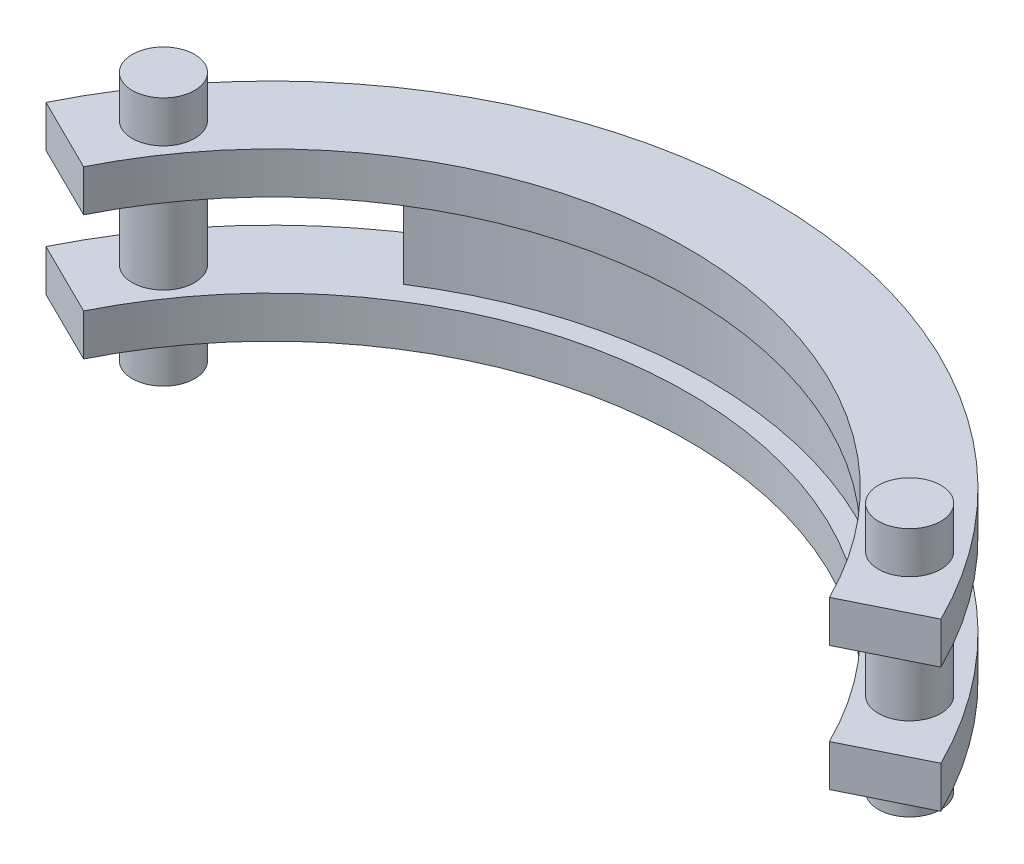
ISO-10303-21;
HEADER;
FILE_DESCRIPTION(('STEP AP214'),'2;1');
FILE_NAME('part.step','',(''),(''),'','','');
FILE_SCHEMA(('AUTOMOTIVE_DESIGN { 1 0 10303 214 1 1 1 1 }'));
ENDSEC;
DATA;
#1=APPLICATION_CONTEXT('core data for automotive mechanical design processes');
#2=APPLICATION_PROTOCOL_DEFINITION('international standard','automotive_design',2000,#1);
#3=PRODUCT_CONTEXT('',#1,'mechanical');
#4=PRODUCT('Part','Part','',(#3));
#5=PRODUCT_RELATED_PRODUCT_CATEGORY('part','',(#4));
#6=PRODUCT_DEFINITION_FORMATION('','',#4);
#7=PRODUCT_DEFINITION_CONTEXT('part definition',#1,'design');
#8=PRODUCT_DEFINITION('design','',#6,#7);
#9=PRODUCT_DEFINITION_SHAPE('','',#8);
#10=(LENGTH_UNIT() NAMED_UNIT(*) SI_UNIT(.MILLI.,.METRE.));
#11=(NAMED_UNIT(*) PLANE_ANGLE_UNIT() SI_UNIT($,.RADIAN.));
#12=(NAMED_UNIT(*) SI_UNIT($,.STERADIAN.) SOLID_ANGLE_UNIT());
#13=UNCERTAINTY_MEASURE_WITH_UNIT(LENGTH_MEASURE(1.E-05),#10,'distance_accuracy_value','');
#14=(GEOMETRIC_REPRESENTATION_CONTEXT(3) GLOBAL_UNCERTAINTY_ASSIGNED_CONTEXT((#13)) GLOBAL_UNIT_ASSIGNED_CONTEXT((#10,
#11,#12)) REPRESENTATION_CONTEXT('',''));
#15=CARTESIAN_POINT('',(0.,0.,0.));
#16=DIRECTION('',(0.,0.,1.));
#17=DIRECTION('',(1.,0.,0.));
#18=AXIS2_PLACEMENT_3D('',#15,#16,#17);
#19=CARTESIAN_POINT('',(0.,10.,0.));
#20=DIRECTION('',(0.,-1.,0.));
#21=DIRECTION('',(0.,0.,-1.));
#22=AXIS2_PLACEMENT_3D('',#19,#20,#21);
#23=PLANE('',#22);
#24=CARTESIAN_POINT('',(89.6581173448026,10.,-63.6162090952759));
#25=DIRECTION('',(0.,1.,0.));
#26=DIRECTION('',(0.,0.,-1.));
#27=AXIS2_PLACEMENT_3D('',#24,#25,#26);
#28=CIRCLE('',#27,7.50000000000001);
#29=CARTESIAN_POINT('',(89.6581173448026,10.,-71.1162090952759));
#30=VERTEX_POINT('',#29);
#31=EDGE_CURVE('E150',#30,#30,#28,.T.);
#32=ORIENTED_EDGE('',*,*,#31,.F.);
#33=EDGE_LOOP('',(#32));
#34=FACE_BOUND('',#33,.T.);
#35=CARTESIAN_POINT('',(-89.6581173448026,10.,-63.6162090952759));
#36=DIRECTION('',(0.,-1.,0.));
#37=DIRECTION('',(0.,0.,-1.));
#38=AXIS2_PLACEMENT_3D('',#35,#36,#37);
#39=CIRCLE('',#38,7.50000000000001);
#40=CARTESIAN_POINT('',(-89.6581173448026,10.,-71.1162090952759));
#41=VERTEX_POINT('',#40);
#42=EDGE_CURVE('E175',#41,#41,#39,.T.);
#43=ORIENTED_EDGE('',*,*,#42,.T.);
#44=EDGE_LOOP('',(#43));
#45=FACE_BOUND('',#44,.T.);
#46=CARTESIAN_POINT('',(0.,10.,0.));
#47=DIRECTION('',(0.,1.,0.));
#48=DIRECTION('',(0.,0.,-1.));
#49=AXIS2_PLACEMENT_3D('',#46,#47,#48);
#50=CIRCLE('',#49,120.);
#51=CARTESIAN_POINT('',(107.52965302655,10.,-53.2670040455598));
#52=VERTEX_POINT('',#51);
#53=CARTESIAN_POINT('',(-107.52965302655,10.,-53.2670040455598));
#54=VERTEX_POINT('',#53);
#55=EDGE_CURVE('E228',#52,#54,#50,.T.);
#56=ORIENTED_EDGE('',*,*,#55,.T.);
#57=DIRECTION('',(0.89608044188792,0.,0.443891700379664));
#58=VECTOR('',#57,1.);
#59=CARTESIAN_POINT('',(-107.52965302655,10.,-53.2670040455598));
#60=LINE('',#59,#58);
#61=CARTESIAN_POINT('',(-89.608044188792,10.,-44.3891700379665));
#62=VERTEX_POINT('',#61);
#63=EDGE_CURVE('E231',#54,#62,#60,.T.);
#64=ORIENTED_EDGE('',*,*,#63,.T.);
#65=CARTESIAN_POINT('',(0.,10.,0.));
#66=DIRECTION('',(0.,-1.,0.));
#67=DIRECTION('',(0.,0.,-1.));
#68=AXIS2_PLACEMENT_3D('',#65,#66,#67);
#69=CIRCLE('',#68,100.);
#70=CARTESIAN_POINT('',(89.608044188792,10.,-44.3891700379665));
#71=VERTEX_POINT('',#70);
#72=EDGE_CURVE('E226',#62,#71,#69,.T.);
#73=ORIENTED_EDGE('',*,*,#72,.T.);
#74=DIRECTION('',(-0.89608044188792,0.,0.443891700379664));
#75=VECTOR('',#74,1.);
#76=CARTESIAN_POINT('',(107.52965302655,10.,-53.2670040455598));
#77=LINE('',#76,#75);
#78=EDGE_CURVE('E155',#52,#71,#77,.T.);
#79=ORIENTED_EDGE('',*,*,#78,.F.);
#80=EDGE_LOOP('',(#56,#64,#73,#79));
#81=FACE_BOUND('',#80,.T.);
#82=CARTESIAN_POINT('',(0.,10.,0.));
#83=DIRECTION('',(0.,1.,0.));
#84=DIRECTION('',(0.,0.,1.));
#85=AXIS2_PLACEMENT_3D('',#82,#83,#84);
#86=CIRCLE('',#85,115.);
#87=CARTESIAN_POINT('',(62.0972802906275,10.,-96.7932217694361));
#88=VERTEX_POINT('',#87);
#89=CARTESIAN_POINT('',(-62.0972802906275,10.,-96.7932217694361));
#90=VERTEX_POINT('',#89);
#91=EDGE_CURVE('E48',#88,#90,#86,.T.);
#92=ORIENTED_EDGE('',*,*,#91,.F.);
#93=DIRECTION('',(0.539976350353283,0.,-0.841680189299445));
#94=VECTOR('',#93,1.);
#95=CARTESIAN_POINT('',(62.0972802906275,10.,-96.7932217694361));
#96=LINE('',#95,#94);
#97=CARTESIAN_POINT('',(56.6975167870947,10.,-88.3764198764417));
#98=VERTEX_POINT('',#97);
#99=EDGE_CURVE('E52',#98,#88,#96,.T.);
#100=ORIENTED_EDGE('',*,*,#99,.F.);
#101=CARTESIAN_POINT('',(0.,10.,0.));
#102=DIRECTION('',(0.,-1.,0.));
#103=DIRECTION('',(0.,0.,1.));
#104=AXIS2_PLACEMENT_3D('',#101,#102,#103);
#105=CIRCLE('',#104,105.);
#106=CARTESIAN_POINT('',(-56.6975167870947,10.,-88.3764198764417));
#107=VERTEX_POINT('',#106);
#108=EDGE_CURVE('E210',#107,#98,#105,.T.);
#109=ORIENTED_EDGE('',*,*,#108,.F.);
#110=DIRECTION('',(0.539976350353283,0.,0.841680189299445));
#111=VECTOR('',#110,1.);
#112=CARTESIAN_POINT('',(-62.0972802906275,10.,-96.7932217694361));
#113=LINE('',#112,#111);
#114=EDGE_CURVE('E207',#90,#107,#113,.T.);
#115=ORIENTED_EDGE('',*,*,#114,.F.);
#116=EDGE_LOOP('',(#92,#100,#109,#115));
#117=FACE_BOUND('',#116,.T.);
#118=ADVANCED_FACE('F33',(#34,#45,#81,#117),#23,.F.);
#119=CARTESIAN_POINT('',(0.,10.,0.));
#120=DIRECTION('',(0.,-1.,0.));
#121=DIRECTION('',(0.,0.,-1.));
#122=AXIS2_PLACEMENT_3D('',#119,#120,#121);
#123=CYLINDRICAL_SURFACE('',#122,100.);
#124=DIRECTION('',(0.,-1.,0.));
#125=VECTOR('',#124,1.);
#126=CARTESIAN_POINT('',(89.608044188792,10.,-44.3891700379665));
#127=LINE('',#126,#125);
#128=CARTESIAN_POINT('',(89.608044188792,0.,-44.3891700379665));
#129=VERTEX_POINT('',#128);
#130=EDGE_CURVE('E158',#71,#129,#127,.T.);
#131=ORIENTED_EDGE('',*,*,#130,.F.);
#132=ORIENTED_EDGE('',*,*,#72,.F.);
#133=DIRECTION('',(0.,-1.,0.));
#134=VECTOR('',#133,1.);
#135=CARTESIAN_POINT('',(-89.608044188792,10.,-44.3891700379665));
#136=LINE('',#135,#134);
#137=CARTESIAN_POINT('',(-89.608044188792,0.,-44.3891700379665));
#138=VERTEX_POINT('',#137);
#139=EDGE_CURVE('E233',#62,#138,#136,.T.);
#140=ORIENTED_EDGE('',*,*,#139,.T.);
#141=CARTESIAN_POINT('',(0.,0.,0.));
#142=DIRECTION('',(0.,-1.,0.));
#143=DIRECTION('',(0.,0.,-1.));
#144=AXIS2_PLACEMENT_3D('',#141,#142,#143);
#145=CIRCLE('',#144,100.);
#146=EDGE_CURVE('E225',#138,#129,#145,.T.);
#147=ORIENTED_EDGE('',*,*,#146,.T.);
#148=EDGE_LOOP('',(#131,#132,#140,#147));
#149=FACE_BOUND('',#148,.T.);
#150=ADVANCED_FACE('F35',(#149),#123,.F.);
#151=CARTESIAN_POINT('',(0.,10.,0.));
#152=DIRECTION('',(0.,-1.,0.));
#153=DIRECTION('',(0.,0.,-1.));
#154=AXIS2_PLACEMENT_3D('',#151,#152,#153);
#155=CYLINDRICAL_SURFACE('',#154,120.);
#156=CARTESIAN_POINT('',(0.,0.,0.));
#157=DIRECTION('',(0.,1.,0.));
#158=DIRECTION('',(0.,0.,-1.));
#159=AXIS2_PLACEMENT_3D('',#156,#157,#158);
#160=CIRCLE('',#159,120.);
#161=CARTESIAN_POINT('',(107.52965302655,0.,-53.2670040455598));
#162=VERTEX_POINT('',#161);
#163=CARTESIAN_POINT('',(-107.52965302655,0.,-53.2670040455598));
#164=VERTEX_POINT('',#163);
#165=EDGE_CURVE('E235',#162,#164,#160,.T.);
#166=ORIENTED_EDGE('',*,*,#165,.T.);
#167=DIRECTION('',(0.,-1.,0.));
#168=VECTOR('',#167,1.);
#169=CARTESIAN_POINT('',(-107.52965302655,10.,-53.2670040455598));
#170=LINE('',#169,#168);
#171=EDGE_CURVE('E240',#54,#164,#170,.T.);
#172=ORIENTED_EDGE('',*,*,#171,.F.);
#173=ORIENTED_EDGE('',*,*,#55,.F.);
#174=DIRECTION('',(0.,-1.,0.));
#175=VECTOR('',#174,1.);
#176=CARTESIAN_POINT('',(107.52965302655,10.,-53.2670040455598));
#177=LINE('',#176,#175);
#178=EDGE_CURVE('E163',#52,#162,#177,.T.);
#179=ORIENTED_EDGE('',*,*,#178,.T.);
#180=EDGE_LOOP('',(#166,#172,#173,#179));
#181=FACE_BOUND('',#180,.T.);
#182=ADVANCED_FACE('F278',(#181),#155,.T.);
#183=CARTESIAN_POINT('',(-107.52965302655,10.,-53.2670040455598));
#184=DIRECTION('',(0.443891700379664,0.,-0.89608044188792));
#185=DIRECTION('',(-0.89608044188792,0.,-0.443891700379664));
#186=AXIS2_PLACEMENT_3D('',#183,#184,#185);
#187=PLANE('',#186);
#188=DIRECTION('',(0.89608044188792,0.,0.443891700379664));
#189=VECTOR('',#188,1.);
#190=CARTESIAN_POINT('',(-107.52965302655,0.,-53.2670040455598));
#191=LINE('',#190,#189);
#192=EDGE_CURVE('E229',#164,#138,#191,.T.);
#193=ORIENTED_EDGE('',*,*,#192,.T.);
#194=ORIENTED_EDGE('',*,*,#139,.F.);
#195=ORIENTED_EDGE('',*,*,#63,.F.);
#196=ORIENTED_EDGE('',*,*,#171,.T.);
#197=EDGE_LOOP('',(#193,#194,#195,#196));
#198=FACE_BOUND('',#197,.T.);
#199=ADVANCED_FACE('F289',(#198),#187,.F.);
#200=CARTESIAN_POINT('',(0.,0.,0.));
#201=DIRECTION('',(0.,-1.,0.));
#202=DIRECTION('',(0.,0.,-1.));
#203=AXIS2_PLACEMENT_3D('',#200,#201,#202);
#204=PLANE('',#203);
#205=DIRECTION('',(-0.89608044188792,0.,0.443891700379664));
#206=VECTOR('',#205,1.);
#207=CARTESIAN_POINT('',(107.52965302655,0.,-53.2670040455598));
#208=LINE('',#207,#206);
#209=EDGE_CURVE('E141',#162,#129,#208,.T.);
#210=ORIENTED_EDGE('',*,*,#209,.T.);
#211=ORIENTED_EDGE('',*,*,#146,.F.);
#212=ORIENTED_EDGE('',*,*,#192,.F.);
#213=ORIENTED_EDGE('',*,*,#165,.F.);
#214=EDGE_LOOP('',(#210,#211,#212,#213));
#215=FACE_BOUND('',#214,.T.);
#216=CARTESIAN_POINT('',(89.6581173448026,0.,-63.6162090952759));
#217=DIRECTION('',(0.,-1.,0.));
#218=DIRECTION('',(0.,0.,-1.));
#219=AXIS2_PLACEMENT_3D('',#216,#217,#218);
#220=CIRCLE('',#219,7.50000000000001);
#221=CARTESIAN_POINT('',(89.6581173448026,0.,-71.1162090952759));
#222=VERTEX_POINT('',#221);
#223=EDGE_CURVE('E11',#222,#222,#220,.T.);
#224=ORIENTED_EDGE('',*,*,#223,.F.);
#225=EDGE_LOOP('',(#224));
#226=FACE_BOUND('',#225,.T.);
#227=CARTESIAN_POINT('',(-89.6581173448026,0.,-63.6162090952759));
#228=DIRECTION('',(0.,-1.,0.));
#229=DIRECTION('',(0.,0.,-1.));
#230=AXIS2_PLACEMENT_3D('',#227,#228,#229);
#231=CIRCLE('',#230,7.50000000000001);
#232=CARTESIAN_POINT('',(-89.6581173448026,0.,-71.1162090952759));
#233=VERTEX_POINT('',#232);
#234=EDGE_CURVE('E176',#233,#233,#231,.T.);
#235=ORIENTED_EDGE('',*,*,#234,.F.);
#236=EDGE_LOOP('',(#235));
#237=FACE_BOUND('',#236,.T.);
#238=ADVANCED_FACE('F286',(#215,#226,#237),#204,.T.);
#239=CARTESIAN_POINT('',(0.,20.,0.));
#240=DIRECTION('',(0.,-1.,0.));
#241=DIRECTION('',(0.,0.,-1.));
#242=AXIS2_PLACEMENT_3D('',#239,#240,#241);
#243=CYLINDRICAL_SURFACE('',#242,115.);
#244=ORIENTED_EDGE('',*,*,#91,.T.);
#245=DIRECTION('',(0.,-1.,0.));
#246=VECTOR('',#245,1.);
#247=CARTESIAN_POINT('',(-62.0972802906275,20.,-96.7932217694361));
#248=LINE('',#247,#246);
#249=CARTESIAN_POINT('',(-62.0972802906275,30.,-96.7932217694361));
#250=VERTEX_POINT('',#249);
#251=EDGE_CURVE('E222',#250,#90,#248,.T.);
#252=ORIENTED_EDGE('',*,*,#251,.F.);
#253=CARTESIAN_POINT('',(0.,30.,0.));
#254=DIRECTION('',(0.,1.,0.));
#255=DIRECTION('',(0.,0.,1.));
#256=AXIS2_PLACEMENT_3D('',#253,#254,#255);
#257=CIRCLE('',#256,115.);
#258=CARTESIAN_POINT('',(62.0972802906275,30.,-96.7932217694361));
#259=VERTEX_POINT('',#258);
#260=EDGE_CURVE('E182',#259,#250,#257,.T.);
#261=ORIENTED_EDGE('',*,*,#260,.F.);
#262=DIRECTION('',(0.,-1.,0.));
#263=VECTOR('',#262,1.);
#264=CARTESIAN_POINT('',(62.0972802906275,20.,-96.7932217694361));
#265=LINE('',#264,#263);
#266=EDGE_CURVE('E213',#259,#88,#265,.T.);
#267=ORIENTED_EDGE('',*,*,#266,.T.);
#268=EDGE_LOOP('',(#244,#252,#261,#267));
#269=FACE_BOUND('',#268,.T.);
#270=ADVANCED_FACE('F284',(#269),#243,.T.);
#271=CARTESIAN_POINT('',(-62.0972802906275,20.,-96.7932217694361));
#272=DIRECTION('',(0.841680189299445,0.,-0.539976350353282));
#273=DIRECTION('',(-0.539976350353282,0.,-0.841680189299445));
#274=AXIS2_PLACEMENT_3D('',#271,#272,#273);
#275=PLANE('',#274);
#276=ORIENTED_EDGE('',*,*,#114,.T.);
#277=DIRECTION('',(0.,-1.,0.));
#278=VECTOR('',#277,1.);
#279=CARTESIAN_POINT('',(-56.6975167870947,20.,-88.3764198764417));
#280=LINE('',#279,#278);
#281=CARTESIAN_POINT('',(-56.6975167870947,30.,-88.3764198764417));
#282=VERTEX_POINT('',#281);
#283=EDGE_CURVE('E219',#282,#107,#280,.T.);
#284=ORIENTED_EDGE('',*,*,#283,.F.);
#285=DIRECTION('',(0.539976350353283,0.,0.841680189299445));
#286=VECTOR('',#285,1.);
#287=CARTESIAN_POINT('',(-62.0972802906275,30.,-96.7932217694361));
#288=LINE('',#287,#286);
#289=EDGE_CURVE('E185',#250,#282,#288,.T.);
#290=ORIENTED_EDGE('',*,*,#289,.F.);
#291=ORIENTED_EDGE('',*,*,#251,.T.);
#292=EDGE_LOOP('',(#276,#284,#290,#291));
#293=FACE_BOUND('',#292,.T.);
#294=ADVANCED_FACE('F358',(#293),#275,.F.);
#295=CARTESIAN_POINT('',(0.,20.,0.));
#296=DIRECTION('',(0.,-1.,0.));
#297=DIRECTION('',(0.,0.,-1.));
#298=AXIS2_PLACEMENT_3D('',#295,#296,#297);
#299=CYLINDRICAL_SURFACE('',#298,105.);
#300=ORIENTED_EDGE('',*,*,#108,.T.);
#301=DIRECTION('',(0.,-1.,0.));
#302=VECTOR('',#301,1.);
#303=CARTESIAN_POINT('',(56.6975167870947,20.,-88.3764198764417));
#304=LINE('',#303,#302);
#305=CARTESIAN_POINT('',(56.6975167870947,30.,-88.3764198764417));
#306=VERTEX_POINT('',#305);
#307=EDGE_CURVE('E216',#306,#98,#304,.T.);
#308=ORIENTED_EDGE('',*,*,#307,.F.);
#309=CARTESIAN_POINT('',(0.,30.,0.));
#310=DIRECTION('',(0.,-1.,0.));
#311=DIRECTION('',(0.,0.,1.));
#312=AXIS2_PLACEMENT_3D('',#309,#310,#311);
#313=CIRCLE('',#312,105.);
#314=EDGE_CURVE('E188',#282,#306,#313,.T.);
#315=ORIENTED_EDGE('',*,*,#314,.F.);
#316=ORIENTED_EDGE('',*,*,#283,.T.);
#317=EDGE_LOOP('',(#300,#308,#315,#316));
#318=FACE_BOUND('',#317,.T.);
#319=ADVANCED_FACE('F355',(#318),#299,.F.);
#320=CARTESIAN_POINT('',(62.0972802906275,20.,-96.7932217694361));
#321=DIRECTION('',(-0.841680189299445,0.,-0.539976350353282));
#322=DIRECTION('',(-0.539976350353282,0.,0.841680189299445));
#323=AXIS2_PLACEMENT_3D('',#320,#321,#322);
#324=PLANE('',#323);
#325=ORIENTED_EDGE('',*,*,#99,.T.);
#326=ORIENTED_EDGE('',*,*,#266,.F.);
#327=DIRECTION('',(0.539976350353283,0.,-0.841680189299445));
#328=VECTOR('',#327,1.);
#329=CARTESIAN_POINT('',(62.0972802906275,30.,-96.7932217694361));
#330=LINE('',#329,#328);
#331=EDGE_CURVE('E191',#306,#259,#330,.T.);
#332=ORIENTED_EDGE('',*,*,#331,.F.);
#333=ORIENTED_EDGE('',*,*,#307,.T.);
#334=EDGE_LOOP('',(#325,#326,#332,#333));
#335=FACE_BOUND('',#334,.T.);
#336=ADVANCED_FACE('F342',(#335),#324,.F.);
#337=CARTESIAN_POINT('',(0.,30.,0.));
#338=DIRECTION('',(0.,1.,0.));
#339=DIRECTION('',(0.,0.,-1.));
#340=AXIS2_PLACEMENT_3D('',#337,#338,#339);
#341=PLANE('',#340);
#342=CARTESIAN_POINT('',(89.6581173448026,30.,-63.6162090952759));
#343=DIRECTION('',(0.,-1.,0.));
#344=DIRECTION('',(0.,0.,1.));
#345=AXIS2_PLACEMENT_3D('',#342,#343,#344);
#346=CIRCLE('',#345,7.50000000000001);
#347=CARTESIAN_POINT('',(89.6581173448026,30.,-56.1162090952759));
#348=VERTEX_POINT('',#347);
#349=EDGE_CURVE('E541',#348,#348,#346,.T.);
#350=ORIENTED_EDGE('',*,*,#349,.F.);
#351=EDGE_LOOP('',(#350));
#352=FACE_BOUND('',#351,.T.);
#353=CARTESIAN_POINT('',(-89.6581173448026,30.,-63.6162090952759));
#354=DIRECTION('',(0.,1.,0.));
#355=DIRECTION('',(0.,0.,1.));
#356=AXIS2_PLACEMENT_3D('',#353,#354,#355);
#357=CIRCLE('',#356,7.50000000000001);
#358=CARTESIAN_POINT('',(-89.6581173448026,30.,-56.1162090952759));
#359=VERTEX_POINT('',#358);
#360=EDGE_CURVE('E172',#359,#359,#357,.T.);
#361=ORIENTED_EDGE('',*,*,#360,.T.);
#362=EDGE_LOOP('',(#361));
#363=FACE_BOUND('',#362,.T.);
#364=DIRECTION('',(-0.89608044188792,0.,0.443891700379664));
#365=VECTOR('',#364,1.);
#366=CARTESIAN_POINT('',(107.52965302655,30.,-53.2670040455598));
#367=LINE('',#366,#365);
#368=CARTESIAN_POINT('',(107.52965302655,30.,-53.2670040455598));
#369=VERTEX_POINT('',#368);
#370=CARTESIAN_POINT('',(89.608044188792,30.,-44.3891700379665));
#371=VERTEX_POINT('',#370);
#372=EDGE_CURVE('E126',#369,#371,#367,.T.);
#373=ORIENTED_EDGE('',*,*,#372,.T.);
#374=CARTESIAN_POINT('',(0.,30.,0.));
#375=DIRECTION('',(0.,-1.,0.));
#376=DIRECTION('',(0.,0.,-1.));
#377=AXIS2_PLACEMENT_3D('',#374,#375,#376);
#378=CIRCLE('',#377,100.);
#379=CARTESIAN_POINT('',(-89.608044188792,30.,-44.3891700379665));
#380=VERTEX_POINT('',#379);
#381=EDGE_CURVE('E132',#380,#371,#378,.T.);
#382=ORIENTED_EDGE('',*,*,#381,.F.);
#383=DIRECTION('',(0.89608044188792,0.,0.443891700379664));
#384=VECTOR('',#383,1.);
#385=CARTESIAN_POINT('',(-107.52965302655,30.,-53.2670040455598));
#386=LINE('',#385,#384);
#387=CARTESIAN_POINT('',(-107.52965302655,30.,-53.2670040455598));
#388=VERTEX_POINT('',#387);
#389=EDGE_CURVE('E128',#388,#380,#386,.T.);
#390=ORIENTED_EDGE('',*,*,#389,.F.);
#391=CARTESIAN_POINT('',(0.,30.,0.));
#392=DIRECTION('',(0.,1.,0.));
#393=DIRECTION('',(0.,0.,-1.));
#394=AXIS2_PLACEMENT_3D('',#391,#392,#393);
#395=CIRCLE('',#394,120.);
#396=EDGE_CURVE('E120',#369,#388,#395,.T.);
#397=ORIENTED_EDGE('',*,*,#396,.F.);
#398=EDGE_LOOP('',(#373,#382,#390,#397));
#399=FACE_BOUND('',#398,.T.);
#400=ORIENTED_EDGE('',*,*,#260,.T.);
#401=ORIENTED_EDGE('',*,*,#289,.T.);
#402=ORIENTED_EDGE('',*,*,#314,.T.);
#403=ORIENTED_EDGE('',*,*,#331,.T.);
#404=EDGE_LOOP('',(#400,#401,#402,#403));
#405=FACE_BOUND('',#404,.T.);
#406=ADVANCED_FACE('F122',(#352,#363,#399,#405),#341,.F.);
#407=CARTESIAN_POINT('',(0.,30.,0.));
#408=DIRECTION('',(0.,1.,0.));
#409=DIRECTION('',(0.,0.,-1.));
#410=AXIS2_PLACEMENT_3D('',#407,#408,#409);
#411=CYLINDRICAL_SURFACE('',#410,100.);
#412=DIRECTION('',(0.,1.,0.));
#413=VECTOR('',#412,1.);
#414=CARTESIAN_POINT('',(89.608044188792,30.,-44.3891700379665));
#415=LINE('',#414,#413);
#416=CARTESIAN_POINT('',(89.608044188792,40.,-44.3891700379665));
#417=VERTEX_POINT('',#416);
#418=EDGE_CURVE('E142',#371,#417,#415,.T.);
#419=ORIENTED_EDGE('',*,*,#418,.T.);
#420=CARTESIAN_POINT('',(0.,40.,0.));
#421=DIRECTION('',(0.,-1.,0.));
#422=DIRECTION('',(0.,0.,-1.));
#423=AXIS2_PLACEMENT_3D('',#420,#421,#422);
#424=CIRCLE('',#423,100.);
#425=CARTESIAN_POINT('',(-89.608044188792,40.,-44.3891700379665));
#426=VERTEX_POINT('',#425);
#427=EDGE_CURVE('E194',#426,#417,#424,.T.);
#428=ORIENTED_EDGE('',*,*,#427,.F.);
#429=DIRECTION('',(0.,1.,0.));
#430=VECTOR('',#429,1.);
#431=CARTESIAN_POINT('',(-89.608044188792,30.,-44.3891700379665));
#432=LINE('',#431,#430);
#433=EDGE_CURVE('E198',#380,#426,#432,.T.);
#434=ORIENTED_EDGE('',*,*,#433,.F.);
#435=ORIENTED_EDGE('',*,*,#381,.T.);
#436=EDGE_LOOP('',(#419,#428,#434,#435));
#437=FACE_BOUND('',#436,.T.);
#438=ADVANCED_FACE('F341',(#437),#411,.F.);
#439=CARTESIAN_POINT('',(0.,30.,0.));
#440=DIRECTION('',(0.,1.,0.));
#441=DIRECTION('',(0.,0.,-1.));
#442=AXIS2_PLACEMENT_3D('',#439,#440,#441);
#443=CYLINDRICAL_SURFACE('',#442,120.);
#444=ORIENTED_EDGE('',*,*,#396,.T.);
#445=DIRECTION('',(0.,1.,0.));
#446=VECTOR('',#445,1.);
#447=CARTESIAN_POINT('',(-107.52965302655,30.,-53.2670040455598));
#448=LINE('',#447,#446);
#449=CARTESIAN_POINT('',(-107.52965302655,40.,-53.2670040455598));
#450=VERTEX_POINT('',#449);
#451=EDGE_CURVE('E204',#388,#450,#448,.T.);
#452=ORIENTED_EDGE('',*,*,#451,.T.);
#453=CARTESIAN_POINT('',(0.,40.,0.));
#454=DIRECTION('',(0.,1.,0.));
#455=DIRECTION('',(0.,0.,-1.));
#456=AXIS2_PLACEMENT_3D('',#453,#454,#455);
#457=CIRCLE('',#456,120.);
#458=CARTESIAN_POINT('',(107.52965302655,40.,-53.2670040455598));
#459=VERTEX_POINT('',#458);
#460=EDGE_CURVE('E137',#459,#450,#457,.T.);
#461=ORIENTED_EDGE('',*,*,#460,.F.);
#462=DIRECTION('',(0.,1.,0.));
#463=VECTOR('',#462,1.);
#464=CARTESIAN_POINT('',(107.52965302655,30.,-53.2670040455598));
#465=LINE('',#464,#463);
#466=EDGE_CURVE('E135',#369,#459,#465,.T.);
#467=ORIENTED_EDGE('',*,*,#466,.F.);
#468=EDGE_LOOP('',(#444,#452,#461,#467));
#469=FACE_BOUND('',#468,.T.);
#470=ADVANCED_FACE('F136',(#469),#443,.T.);
#471=CARTESIAN_POINT('',(-107.52965302655,30.,-53.2670040455598));
#472=DIRECTION('',(0.443891700379664,0.,-0.89608044188792));
#473=DIRECTION('',(-0.89608044188792,0.,-0.443891700379664));
#474=AXIS2_PLACEMENT_3D('',#471,#472,#473);
#475=PLANE('',#474);
#476=DIRECTION('',(0.89608044188792,0.,0.443891700379664));
#477=VECTOR('',#476,1.);
#478=CARTESIAN_POINT('',(-107.52965302655,40.,-53.2670040455598));
#479=LINE('',#478,#477);
#480=EDGE_CURVE('E195',#450,#426,#479,.T.);
#481=ORIENTED_EDGE('',*,*,#480,.F.);
#482=ORIENTED_EDGE('',*,*,#451,.F.);
#483=ORIENTED_EDGE('',*,*,#389,.T.);
#484=ORIENTED_EDGE('',*,*,#433,.T.);
#485=EDGE_LOOP('',(#481,#482,#483,#484));
#486=FACE_BOUND('',#485,.T.);
#487=ADVANCED_FACE('F254',(#486),#475,.F.);
#488=CARTESIAN_POINT('',(0.,40.,0.));
#489=DIRECTION('',(0.,1.,0.));
#490=DIRECTION('',(0.,0.,-1.));
#491=AXIS2_PLACEMENT_3D('',#488,#489,#490);
#492=PLANE('',#491);
#493=ORIENTED_EDGE('',*,*,#460,.T.);
#494=ORIENTED_EDGE('',*,*,#480,.T.);
#495=ORIENTED_EDGE('',*,*,#427,.T.);
#496=DIRECTION('',(-0.89608044188792,0.,0.443891700379664));
#497=VECTOR('',#496,1.);
#498=CARTESIAN_POINT('',(107.52965302655,40.,-53.2670040455598));
#499=LINE('',#498,#497);
#500=EDGE_CURVE('E147',#459,#417,#499,.T.);
#501=ORIENTED_EDGE('',*,*,#500,.F.);
#502=EDGE_LOOP('',(#493,#494,#495,#501));
#503=FACE_BOUND('',#502,.T.);
#504=CARTESIAN_POINT('',(89.6581173448026,40.,-63.6162090952759));
#505=DIRECTION('',(0.,1.,0.));
#506=DIRECTION('',(0.,0.,1.));
#507=AXIS2_PLACEMENT_3D('',#504,#505,#506);
#508=CIRCLE('',#507,7.50000000000001);
#509=CARTESIAN_POINT('',(89.6581173448026,40.,-56.1162090952759));
#510=VERTEX_POINT('',#509);
#511=EDGE_CURVE('E41',#510,#510,#508,.T.);
#512=ORIENTED_EDGE('',*,*,#511,.F.);
#513=EDGE_LOOP('',(#512));
#514=FACE_BOUND('',#513,.T.);
#515=CARTESIAN_POINT('',(-89.6581173448026,40.,-63.6162090952759));
#516=DIRECTION('',(0.,1.,0.));
#517=DIRECTION('',(0.,0.,1.));
#518=AXIS2_PLACEMENT_3D('',#515,#516,#517);
#519=CIRCLE('',#518,7.50000000000001);
#520=CARTESIAN_POINT('',(-89.6581173448026,40.,-56.1162090952759));
#521=VERTEX_POINT('',#520);
#522=EDGE_CURVE('E179',#521,#521,#519,.T.);
#523=ORIENTED_EDGE('',*,*,#522,.F.);
#524=EDGE_LOOP('',(#523));
#525=FACE_BOUND('',#524,.T.);
#526=ADVANCED_FACE('F250',(#503,#514,#525),#492,.T.);
#527=CARTESIAN_POINT('',(-89.6581173448026,50.,-63.6162090952759));
#528=DIRECTION('',(0.,-1.,0.));
#529=DIRECTION('',(0.,0.,-1.));
#530=AXIS2_PLACEMENT_3D('',#527,#528,#529);
#531=PLANE('',#530);
#532=CARTESIAN_POINT('',(-89.6581173448026,50.,-63.6162090952759));
#533=DIRECTION('',(0.,-1.,0.));
#534=DIRECTION('',(0.,0.,-1.));
#535=AXIS2_PLACEMENT_3D('',#532,#533,#534);
#536=CIRCLE('',#535,7.50000000000001);
#537=CARTESIAN_POINT('',(-89.6581173448026,50.,-71.1162090952759));
#538=VERTEX_POINT('',#537);
#539=EDGE_CURVE('E169',#538,#538,#536,.T.);
#540=ORIENTED_EDGE('',*,*,#539,.F.);
#541=EDGE_LOOP('',(#540));
#542=FACE_BOUND('',#541,.T.);
#543=ADVANCED_FACE('F253',(#542),#531,.F.);
#544=CARTESIAN_POINT('',(-89.6581173448026,50.,-63.6162090952759));
#545=DIRECTION('',(0.,-1.,0.));
#546=DIRECTION('',(0.,0.,-1.));
#547=AXIS2_PLACEMENT_3D('',#544,#545,#546);
#548=CYLINDRICAL_SURFACE('',#547,7.50000000000001);
#549=ORIENTED_EDGE('',*,*,#522,.T.);
#550=EDGE_LOOP('',(#549));
#551=FACE_BOUND('',#550,.T.);
#552=ORIENTED_EDGE('',*,*,#539,.T.);
#553=EDGE_LOOP('',(#552));
#554=FACE_BOUND('',#553,.T.);
#555=ADVANCED_FACE('F259',(#551,#554),#548,.T.);
#556=ORIENTED_EDGE('',*,*,#360,.F.);
#557=EDGE_LOOP('',(#556));
#558=FACE_BOUND('',#557,.T.);
#559=ORIENTED_EDGE('',*,*,#42,.F.);
#560=EDGE_LOOP('',(#559));
#561=FACE_BOUND('',#560,.T.);
#562=ADVANCED_FACE('F262',(#558,#561),#548,.T.);
#563=ORIENTED_EDGE('',*,*,#234,.T.);
#564=EDGE_LOOP('',(#563));
#565=FACE_BOUND('',#564,.T.);
#566=CARTESIAN_POINT('',(-89.6581173448026,-10.,-63.6162090952759));
#567=DIRECTION('',(0.,-1.,0.));
#568=DIRECTION('',(0.,0.,-1.));
#569=AXIS2_PLACEMENT_3D('',#566,#567,#568);
#570=CIRCLE('',#569,7.50000000000001);
#571=CARTESIAN_POINT('',(-89.6581173448026,-10.,-71.1162090952759));
#572=VERTEX_POINT('',#571);
#573=EDGE_CURVE('E166',#572,#572,#570,.T.);
#574=ORIENTED_EDGE('',*,*,#573,.F.);
#575=EDGE_LOOP('',(#574));
#576=FACE_BOUND('',#575,.T.);
#577=ADVANCED_FACE('F264',(#565,#576),#548,.T.);
#578=CARTESIAN_POINT('',(-89.6581173448026,-10.,-63.6162090952759));
#579=DIRECTION('',(0.,-1.,0.));
#580=DIRECTION('',(0.,0.,-1.));
#581=AXIS2_PLACEMENT_3D('',#578,#579,#580);
#582=PLANE('',#581);
#583=ORIENTED_EDGE('',*,*,#573,.T.);
#584=EDGE_LOOP('',(#583));
#585=FACE_BOUND('',#584,.T.);
#586=ADVANCED_FACE('F322',(#585),#582,.T.);
#587=CARTESIAN_POINT('',(89.6581173448026,50.,-63.6162090952759));
#588=DIRECTION('',(0.,-1.,0.));
#589=DIRECTION('',(0.,0.,-1.));
#590=AXIS2_PLACEMENT_3D('',#587,#588,#589);
#591=PLANE('',#590);
#592=CARTESIAN_POINT('',(89.6581173448026,50.,-63.6162090952759));
#593=DIRECTION('',(0.,1.,0.));
#594=DIRECTION('',(0.,0.,-1.));
#595=AXIS2_PLACEMENT_3D('',#592,#593,#594);
#596=CIRCLE('',#595,7.50000000000001);
#597=CARTESIAN_POINT('',(89.6581173448026,50.,-71.1162090952759));
#598=VERTEX_POINT('',#597);
#599=EDGE_CURVE('E538',#598,#598,#596,.T.);
#600=ORIENTED_EDGE('',*,*,#599,.T.);
#601=EDGE_LOOP('',(#600));
#602=FACE_BOUND('',#601,.T.);
#603=ADVANCED_FACE('F324',(#602),#591,.F.);
#604=CARTESIAN_POINT('',(89.6581173448026,50.,-63.6162090952759));
#605=DIRECTION('',(0.,-1.,0.));
#606=DIRECTION('',(0.,0.,-1.));
#607=AXIS2_PLACEMENT_3D('',#604,#605,#606);
#608=CYLINDRICAL_SURFACE('',#607,7.50000000000001);
#609=ORIENTED_EDGE('',*,*,#511,.T.);
#610=EDGE_LOOP('',(#609));
#611=FACE_BOUND('',#610,.T.);
#612=ORIENTED_EDGE('',*,*,#599,.F.);
#613=EDGE_LOOP('',(#612));
#614=FACE_BOUND('',#613,.T.);
#615=ADVANCED_FACE('F247',(#611,#614),#608,.T.);
#616=CARTESIAN_POINT('',(107.52965302655,30.,-53.2670040455598));
#617=DIRECTION('',(-0.443891700379664,0.,-0.89608044188792));
#618=DIRECTION('',(0.89608044188792,0.,-0.443891700379664));
#619=AXIS2_PLACEMENT_3D('',#616,#617,#618);
#620=PLANE('',#619);
#621=ORIENTED_EDGE('',*,*,#500,.T.);
#622=ORIENTED_EDGE('',*,*,#418,.F.);
#623=ORIENTED_EDGE('',*,*,#372,.F.);
#624=ORIENTED_EDGE('',*,*,#466,.T.);
#625=EDGE_LOOP('',(#621,#622,#623,#624));
#626=FACE_BOUND('',#625,.T.);
#627=ADVANCED_FACE('F145',(#626),#620,.F.);
#628=ORIENTED_EDGE('',*,*,#349,.T.);
#629=EDGE_LOOP('',(#628));
#630=FACE_BOUND('',#629,.T.);
#631=ORIENTED_EDGE('',*,*,#31,.T.);
#632=EDGE_LOOP('',(#631));
#633=FACE_BOUND('',#632,.T.);
#634=ADVANCED_FACE('F320',(#630,#633),#608,.T.);
#635=CARTESIAN_POINT('',(89.6581173448026,-10.,-63.6162090952759));
#636=DIRECTION('',(0.,-1.,0.));
#637=DIRECTION('',(0.,0.,-1.));
#638=AXIS2_PLACEMENT_3D('',#635,#636,#637);
#639=PLANE('',#638);
#640=CARTESIAN_POINT('',(89.6581173448026,-10.,-63.6162090952759));
#641=DIRECTION('',(0.,1.,0.));
#642=DIRECTION('',(0.,0.,-1.));
#643=AXIS2_PLACEMENT_3D('',#640,#641,#642);
#644=CIRCLE('',#643,7.50000000000001);
#645=CARTESIAN_POINT('',(89.6581173448026,-10.,-71.1162090952759));
#646=VERTEX_POINT('',#645);
#647=EDGE_CURVE('E536',#646,#646,#644,.T.);
#648=ORIENTED_EDGE('',*,*,#647,.F.);
#649=EDGE_LOOP('',(#648));
#650=FACE_BOUND('',#649,.T.);
#651=ADVANCED_FACE('F317',(#650),#639,.T.);
#652=ORIENTED_EDGE('',*,*,#223,.T.);
#653=EDGE_LOOP('',(#652));
#654=FACE_BOUND('',#653,.T.);
#655=ORIENTED_EDGE('',*,*,#647,.T.);
#656=EDGE_LOOP('',(#655));
#657=FACE_BOUND('',#656,.T.);
#658=ADVANCED_FACE('F312',(#654,#657),#608,.T.);
#659=CARTESIAN_POINT('',(107.52965302655,10.,-53.2670040455598));
#660=DIRECTION('',(-0.443891700379664,0.,-0.89608044188792));
#661=DIRECTION('',(0.89608044188792,0.,-0.443891700379664));
#662=AXIS2_PLACEMENT_3D('',#659,#660,#661);
#663=PLANE('',#662);
#664=ORIENTED_EDGE('',*,*,#209,.F.);
#665=ORIENTED_EDGE('',*,*,#178,.F.);
#666=ORIENTED_EDGE('',*,*,#78,.T.);
#667=ORIENTED_EDGE('',*,*,#130,.T.);
#668=EDGE_LOOP('',(#664,#665,#666,#667));
#669=FACE_BOUND('',#668,.T.);
#670=ADVANCED_FACE('F310',(#669),#663,.F.);
#671=CLOSED_SHELL('',(#118,#150,#182,#199,#238,#270,#294,#319,#336,#406,#438,#470,#487,#526,
#543,#555,#562,#577,#586,#603,#615,#627,#634,#651,#658,#670));
#672=MANIFOLD_SOLID_BREP('B2',#671);
#673=ADVANCED_BREP_SHAPE_REPRESENTATION('',(#18,#672),#14);
#674=SHAPE_DEFINITION_REPRESENTATION(#9,#673);
ENDSEC;
END-ISO-10303-21;
